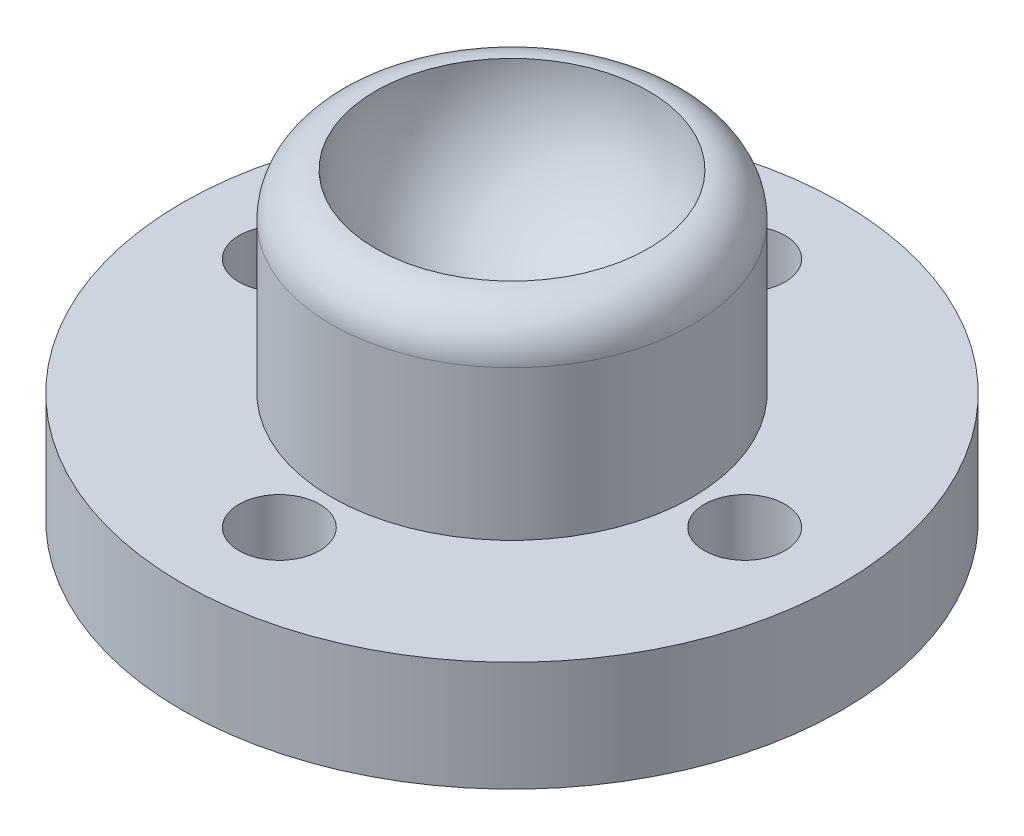
ISO-10303-21;
HEADER;
FILE_DESCRIPTION(('STEP AP214'),'2;1');
FILE_NAME('part.step','',(''),(''),'','','');
FILE_SCHEMA(('AUTOMOTIVE_DESIGN { 1 0 10303 214 1 1 1 1 }'));
ENDSEC;
DATA;
#1=APPLICATION_CONTEXT('core data for automotive mechanical design processes');
#2=APPLICATION_PROTOCOL_DEFINITION('international standard','automotive_design',2000,#1);
#3=PRODUCT_CONTEXT('',#1,'mechanical');
#4=PRODUCT('Part','Part','',(#3));
#5=PRODUCT_RELATED_PRODUCT_CATEGORY('part','',(#4));
#6=PRODUCT_DEFINITION_FORMATION('','',#4);
#7=PRODUCT_DEFINITION_CONTEXT('part definition',#1,'design');
#8=PRODUCT_DEFINITION('design','',#6,#7);
#9=PRODUCT_DEFINITION_SHAPE('','',#8);
#10=(LENGTH_UNIT() NAMED_UNIT(*) SI_UNIT(.MILLI.,.METRE.));
#11=(NAMED_UNIT(*) PLANE_ANGLE_UNIT() SI_UNIT($,.RADIAN.));
#12=(NAMED_UNIT(*) SI_UNIT($,.STERADIAN.) SOLID_ANGLE_UNIT());
#13=UNCERTAINTY_MEASURE_WITH_UNIT(LENGTH_MEASURE(1.E-05),#10,'distance_accuracy_value','');
#14=(GEOMETRIC_REPRESENTATION_CONTEXT(3) GLOBAL_UNCERTAINTY_ASSIGNED_CONTEXT((#13)) GLOBAL_UNIT_ASSIGNED_CONTEXT((#10,
#11,#12)) REPRESENTATION_CONTEXT('',''));
#15=CARTESIAN_POINT('',(0.,0.,0.));
#16=DIRECTION('',(0.,0.,1.));
#17=DIRECTION('',(1.,0.,0.));
#18=AXIS2_PLACEMENT_3D('',#15,#16,#17);
#19=CARTESIAN_POINT('',(0.,6.35,0.));
#20=DIRECTION('',(0.,1.,0.));
#21=DIRECTION('',(0.,0.,1.));
#22=AXIS2_PLACEMENT_3D('',#19,#20,#21);
#23=PLANE('',#22);
#24=CARTESIAN_POINT('',(0.,6.35,0.));
#25=DIRECTION('',(0.,1.,0.));
#26=DIRECTION('',(0.,0.,1.));
#27=AXIS2_PLACEMENT_3D('',#24,#25,#26);
#28=CIRCLE('',#27,10.424468920788);
#29=CARTESIAN_POINT('',(0.,6.35,10.424468920788));
#30=VERTEX_POINT('',#29);
#31=EDGE_CURVE('E40',#30,#30,#28,.T.);
#32=ORIENTED_EDGE('',*,*,#31,.F.);
#33=EDGE_LOOP('',(#32));
#34=FACE_BOUND('',#33,.T.);
#35=CARTESIAN_POINT('',(7.59273832059539E-13,6.35,13.4441797995732));
#36=DIRECTION('',(0.,1.,0.));
#37=DIRECTION('',(0.,0.,1.));
#38=AXIS2_PLACEMENT_3D('',#35,#36,#37);
#39=CIRCLE('',#38,2.32880366283301);
#40=CARTESIAN_POINT('',(7.59273832059539E-13,6.35,15.7729834624062));
#41=VERTEX_POINT('',#40);
#42=EDGE_CURVE('E62',#41,#41,#39,.T.);
#43=ORIENTED_EDGE('',*,*,#42,.F.);
#44=EDGE_LOOP('',(#43));
#45=FACE_BOUND('',#44,.T.);
#46=CARTESIAN_POINT('',(0.,6.35,-13.4441797995732));
#47=DIRECTION('',(0.,1.,0.));
#48=DIRECTION('',(0.,0.,1.));
#49=AXIS2_PLACEMENT_3D('',#46,#47,#48);
#50=CIRCLE('',#49,2.3288036628322);
#51=CARTESIAN_POINT('',(0.,6.35,-11.115376136741));
#52=VERTEX_POINT('',#51);
#53=EDGE_CURVE('E74',#52,#52,#50,.T.);
#54=ORIENTED_EDGE('',*,*,#53,.F.);
#55=EDGE_LOOP('',(#54));
#56=FACE_BOUND('',#55,.T.);
#57=CARTESIAN_POINT('',(0.,6.35,0.));
#58=DIRECTION('',(0.,1.,0.));
#59=DIRECTION('',(0.,0.,1.));
#60=AXIS2_PLACEMENT_3D('',#57,#58,#59);
#61=CIRCLE('',#60,19.05);
#62=CARTESIAN_POINT('',(0.,6.35,19.05));
#63=VERTEX_POINT('',#62);
#64=EDGE_CURVE('E44',#63,#63,#61,.T.);
#65=ORIENTED_EDGE('',*,*,#64,.T.);
#66=EDGE_LOOP('',(#65));
#67=FACE_BOUND('',#66,.T.);
#68=CARTESIAN_POINT('',(13.4441797995735,6.35,-3.79636916029769E-13));
#69=DIRECTION('',(0.,1.,0.));
#70=DIRECTION('',(0.,0.,1.));
#71=AXIS2_PLACEMENT_3D('',#68,#69,#70);
#72=CIRCLE('',#71,2.32880366283249);
#73=CARTESIAN_POINT('',(13.4441797995735,6.35,2.32880366283212));
#74=VERTEX_POINT('',#73);
#75=EDGE_CURVE('E68',#74,#74,#72,.T.);
#76=ORIENTED_EDGE('',*,*,#75,.F.);
#77=EDGE_LOOP('',(#76));
#78=FACE_BOUND('',#77,.T.);
#79=CARTESIAN_POINT('',(-13.4441797995728,6.35,3.8128335320564E-13));
#80=DIRECTION('',(0.,1.,0.));
#81=DIRECTION('',(0.,0.,1.));
#82=AXIS2_PLACEMENT_3D('',#79,#80,#81);
#83=CIRCLE('',#82,2.32880366283281);
#84=CARTESIAN_POINT('',(-13.4441797995728,6.35,2.32880366283319));
#85=VERTEX_POINT('',#84);
#86=EDGE_CURVE('E54',#85,#85,#83,.T.);
#87=ORIENTED_EDGE('',*,*,#86,.F.);
#88=EDGE_LOOP('',(#87));
#89=FACE_BOUND('',#88,.T.);
#90=ADVANCED_FACE('F33',(#34,#45,#56,#67,#78,#89),#23,.T.);
#91=CARTESIAN_POINT('',(0.,0.,0.));
#92=DIRECTION('',(0.,1.,0.));
#93=DIRECTION('',(0.,0.,1.));
#94=AXIS2_PLACEMENT_3D('',#91,#92,#93);
#95=PLANE('',#94);
#96=CARTESIAN_POINT('',(0.,0.,0.));
#97=DIRECTION('',(0.,1.,0.));
#98=DIRECTION('',(0.,0.,1.));
#99=AXIS2_PLACEMENT_3D('',#96,#97,#98);
#100=CIRCLE('',#99,19.05);
#101=CARTESIAN_POINT('',(0.,0.,19.05));
#102=VERTEX_POINT('',#101);
#103=EDGE_CURVE('E49',#102,#102,#100,.T.);
#104=ORIENTED_EDGE('',*,*,#103,.F.);
#105=EDGE_LOOP('',(#104));
#106=FACE_BOUND('',#105,.T.);
#107=CARTESIAN_POINT('',(0.,0.,0.));
#108=DIRECTION('',(0.,1.,0.));
#109=DIRECTION('',(0.,0.,1.));
#110=AXIS2_PLACEMENT_3D('',#107,#108,#109);
#111=CIRCLE('',#110,6.68877016383572);
#112=CARTESIAN_POINT('',(0.,0.,6.68877016383572));
#113=VERTEX_POINT('',#112);
#114=EDGE_CURVE('E77',#113,#113,#111,.T.);
#115=ORIENTED_EDGE('',*,*,#114,.T.);
#116=EDGE_LOOP('',(#115));
#117=FACE_BOUND('',#116,.T.);
#118=CARTESIAN_POINT('',(0.,0.,-13.4441797995732));
#119=DIRECTION('',(0.,1.,0.));
#120=DIRECTION('',(0.,0.,1.));
#121=AXIS2_PLACEMENT_3D('',#118,#119,#120);
#122=CIRCLE('',#121,2.3288036628322);
#123=CARTESIAN_POINT('',(0.,0.,-11.115376136741));
#124=VERTEX_POINT('',#123);
#125=EDGE_CURVE('E71',#124,#124,#122,.T.);
#126=ORIENTED_EDGE('',*,*,#125,.T.);
#127=EDGE_LOOP('',(#126));
#128=FACE_BOUND('',#127,.T.);
#129=CARTESIAN_POINT('',(13.4441797995735,0.,-3.79636916029769E-13));
#130=DIRECTION('',(0.,1.,0.));
#131=DIRECTION('',(0.,0.,1.));
#132=AXIS2_PLACEMENT_3D('',#129,#130,#131);
#133=CIRCLE('',#132,2.32880366283249);
#134=CARTESIAN_POINT('',(13.4441797995735,0.,2.32880366283212));
#135=VERTEX_POINT('',#134);
#136=EDGE_CURVE('E65',#135,#135,#133,.T.);
#137=ORIENTED_EDGE('',*,*,#136,.T.);
#138=EDGE_LOOP('',(#137));
#139=FACE_BOUND('',#138,.T.);
#140=CARTESIAN_POINT('',(7.59273832059539E-13,0.,13.4441797995732));
#141=DIRECTION('',(0.,1.,0.));
#142=DIRECTION('',(0.,0.,1.));
#143=AXIS2_PLACEMENT_3D('',#140,#141,#142);
#144=CIRCLE('',#143,2.32880366283301);
#145=CARTESIAN_POINT('',(7.59273832059539E-13,0.,15.7729834624062));
#146=VERTEX_POINT('',#145);
#147=EDGE_CURVE('E57',#146,#146,#144,.T.);
#148=ORIENTED_EDGE('',*,*,#147,.T.);
#149=EDGE_LOOP('',(#148));
#150=FACE_BOUND('',#149,.T.);
#151=CARTESIAN_POINT('',(-13.4441797995728,0.,3.8128335320564E-13));
#152=DIRECTION('',(0.,1.,0.));
#153=DIRECTION('',(0.,0.,1.));
#154=AXIS2_PLACEMENT_3D('',#151,#152,#153);
#155=CIRCLE('',#154,2.32880366283281);
#156=CARTESIAN_POINT('',(-13.4441797995728,0.,2.32880366283319));
#157=VERTEX_POINT('',#156);
#158=EDGE_CURVE('E58',#157,#157,#155,.T.);
#159=ORIENTED_EDGE('',*,*,#158,.T.);
#160=EDGE_LOOP('',(#159));
#161=FACE_BOUND('',#160,.T.);
#162=ADVANCED_FACE('F88',(#106,#117,#128,#139,#150,#161),#95,.F.);
#163=CARTESIAN_POINT('',(0.,6.35,0.));
#164=DIRECTION('',(0.,-1.,0.));
#165=DIRECTION('',(0.,0.,-1.));
#166=AXIS2_PLACEMENT_3D('',#163,#164,#165);
#167=CYLINDRICAL_SURFACE('',#166,19.05);
#168=ORIENTED_EDGE('',*,*,#64,.F.);
#169=EDGE_LOOP('',(#168));
#170=FACE_BOUND('',#169,.T.);
#171=ORIENTED_EDGE('',*,*,#103,.T.);
#172=EDGE_LOOP('',(#171));
#173=FACE_BOUND('',#172,.T.);
#174=ADVANCED_FACE('F86',(#170,#173),#167,.T.);
#175=CARTESIAN_POINT('',(0.,6.35,0.));
#176=DIRECTION('',(0.,-1.,0.));
#177=DIRECTION('',(0.,0.,-1.));
#178=AXIS2_PLACEMENT_3D('',#175,#176,#177);
#179=CYLINDRICAL_SURFACE('',#178,6.68877016383572);
#180=CARTESIAN_POINT('',(0.,6.35,0.));
#181=DIRECTION('',(0.,1.,0.));
#182=DIRECTION('',(0.,0.,1.));
#183=AXIS2_PLACEMENT_3D('',#180,#181,#182);
#184=CIRCLE('',#183,6.68877016383572);
#185=CARTESIAN_POINT('',(0.,6.35,6.68877016383572));
#186=VERTEX_POINT('',#185);
#187=EDGE_CURVE('E61',#186,#186,#184,.T.);
#188=ORIENTED_EDGE('',*,*,#187,.T.);
#189=EDGE_LOOP('',(#188));
#190=FACE_BOUND('',#189,.T.);
#191=ORIENTED_EDGE('',*,*,#114,.F.);
#192=EDGE_LOOP('',(#191));
#193=FACE_BOUND('',#192,.T.);
#194=ADVANCED_FACE('F124',(#190,#193),#179,.F.);
#195=CARTESIAN_POINT('',(0.,6.35,-13.4441797995732));
#196=DIRECTION('',(0.,-1.,0.));
#197=DIRECTION('',(0.,0.,-1.));
#198=AXIS2_PLACEMENT_3D('',#195,#196,#197);
#199=CYLINDRICAL_SURFACE('',#198,2.3288036628322);
#200=ORIENTED_EDGE('',*,*,#53,.T.);
#201=EDGE_LOOP('',(#200));
#202=FACE_BOUND('',#201,.T.);
#203=ORIENTED_EDGE('',*,*,#125,.F.);
#204=EDGE_LOOP('',(#203));
#205=FACE_BOUND('',#204,.T.);
#206=ADVANCED_FACE('F131',(#202,#205),#199,.F.);
#207=CARTESIAN_POINT('',(13.4441797995735,6.35,-3.79636916029769E-13));
#208=DIRECTION('',(0.,-1.,0.));
#209=DIRECTION('',(0.,0.,-1.));
#210=AXIS2_PLACEMENT_3D('',#207,#208,#209);
#211=CYLINDRICAL_SURFACE('',#210,2.32880366283249);
#212=ORIENTED_EDGE('',*,*,#75,.T.);
#213=EDGE_LOOP('',(#212));
#214=FACE_BOUND('',#213,.T.);
#215=ORIENTED_EDGE('',*,*,#136,.F.);
#216=EDGE_LOOP('',(#215));
#217=FACE_BOUND('',#216,.T.);
#218=ADVANCED_FACE('F114',(#214,#217),#211,.F.);
#219=CARTESIAN_POINT('',(7.59273832059539E-13,6.35,13.4441797995732));
#220=DIRECTION('',(0.,-1.,0.));
#221=DIRECTION('',(0.,0.,-1.));
#222=AXIS2_PLACEMENT_3D('',#219,#220,#221);
#223=CYLINDRICAL_SURFACE('',#222,2.32880366283301);
#224=ORIENTED_EDGE('',*,*,#42,.T.);
#225=EDGE_LOOP('',(#224));
#226=FACE_BOUND('',#225,.T.);
#227=ORIENTED_EDGE('',*,*,#147,.F.);
#228=EDGE_LOOP('',(#227));
#229=FACE_BOUND('',#228,.T.);
#230=ADVANCED_FACE('F105',(#226,#229),#223,.F.);
#231=CARTESIAN_POINT('',(-13.4441797995728,6.35,3.8128335320564E-13));
#232=DIRECTION('',(0.,-1.,0.));
#233=DIRECTION('',(0.,0.,-1.));
#234=AXIS2_PLACEMENT_3D('',#231,#232,#233);
#235=CYLINDRICAL_SURFACE('',#234,2.32880366283281);
#236=ORIENTED_EDGE('',*,*,#86,.T.);
#237=EDGE_LOOP('',(#236));
#238=FACE_BOUND('',#237,.T.);
#239=ORIENTED_EDGE('',*,*,#158,.F.);
#240=EDGE_LOOP('',(#239));
#241=FACE_BOUND('',#240,.T.);
#242=ADVANCED_FACE('F102',(#238,#241),#235,.F.);
#243=CARTESIAN_POINT('',(0.,17.526,0.));
#244=DIRECTION('',(0.,-1.,0.));
#245=DIRECTION('',(0.,0.,-1.));
#246=AXIS2_PLACEMENT_3D('',#243,#244,#245);
#247=CYLINDRICAL_SURFACE('',#246,10.424468920788);
#248=CARTESIAN_POINT('',(0.,14.986,0.));
#249=DIRECTION('',(0.,1.,0.));
#250=DIRECTION('',(0.,0.,1.));
#251=AXIS2_PLACEMENT_3D('',#248,#249,#250);
#252=CIRCLE('',#251,10.424468920788);
#253=CARTESIAN_POINT('',(0.,14.986,10.424468920788));
#254=VERTEX_POINT('',#253);
#255=EDGE_CURVE('E10',#254,#254,#252,.F.);
#256=ORIENTED_EDGE('',*,*,#255,.T.);
#257=EDGE_LOOP('',(#256));
#258=FACE_BOUND('',#257,.T.);
#259=ORIENTED_EDGE('',*,*,#31,.T.);
#260=EDGE_LOOP('',(#259));
#261=FACE_BOUND('',#260,.T.);
#262=ADVANCED_FACE('F104',(#258,#261),#247,.T.);
#263=CARTESIAN_POINT('',(0.,6.35,0.));
#264=DIRECTION('',(0.,1.,0.));
#265=DIRECTION('',(0.,0.,1.));
#266=AXIS2_PLACEMENT_3D('',#263,#264,#265);
#267=PLANE('',#266);
#268=ORIENTED_EDGE('',*,*,#187,.F.);
#269=EDGE_LOOP('',(#268));
#270=FACE_BOUND('',#269,.T.);
#271=ADVANCED_FACE('F112',(#270),#267,.F.);
#272=CARTESIAN_POINT('',(0.,14.986,0.));
#273=DIRECTION('',(0.,1.,0.));
#274=DIRECTION('',(0.,0.,1.));
#275=AXIS2_PLACEMENT_3D('',#272,#273,#274);
#276=TOROIDAL_SURFACE('',#275,7.884468920788,2.54);
#277=ORIENTED_EDGE('',*,*,#255,.F.);
#278=EDGE_LOOP('',(#277));
#279=FACE_BOUND('',#278,.T.);
#280=CARTESIAN_POINT('',(0.,17.526,0.));
#281=DIRECTION('',(0.,1.,0.));
#282=DIRECTION('',(0.,0.,1.));
#283=AXIS2_PLACEMENT_3D('',#280,#281,#282);
#284=CIRCLE('',#283,7.884468920788);
#285=CARTESIAN_POINT('',(0.,17.526,7.884468920788));
#286=VERTEX_POINT('',#285);
#287=EDGE_CURVE('E53',#286,#286,#284,.F.);
#288=ORIENTED_EDGE('',*,*,#287,.T.);
#289=EDGE_LOOP('',(#288));
#290=FACE_BOUND('',#289,.T.);
#291=ADVANCED_FACE('F35',(#279,#290),#276,.T.);
#292=CARTESIAN_POINT('',(0.,17.526,0.));
#293=DIRECTION('',(0.,0.,-1.));
#294=DIRECTION('',(1.,0.,0.));
#295=AXIS2_PLACEMENT_3D('',#292,#293,#294);
#296=SPHERICAL_SURFACE('',#295,7.884468920788);
#297=CARTESIAN_POINT('',(0.,17.526,0.));
#298=DIRECTION('',(0.,1.,0.));
#299=DIRECTION('',(0.,0.,1.));
#300=AXIS2_PLACEMENT_3D('',#297,#298,#299);
#301=SPHERICAL_SURFACE('',#300,7.884468920788);
#302=ORIENTED_EDGE('',*,*,#287,.F.);
#303=EDGE_LOOP('',(#302));
#304=FACE_BOUND('',#303,.T.);
#305=ADVANCED_FACE('F198',(#304),#301,.F.);
#306=CLOSED_SHELL('',(#90,#162,#174,#194,#206,#218,#230,#242,#262,#271,#291,#305));
#307=MANIFOLD_SOLID_BREP('B2',#306);
#308=ADVANCED_BREP_SHAPE_REPRESENTATION('',(#18,#307),#14);
#309=SHAPE_DEFINITION_REPRESENTATION(#9,#308);
ENDSEC;
END-ISO-10303-21;
